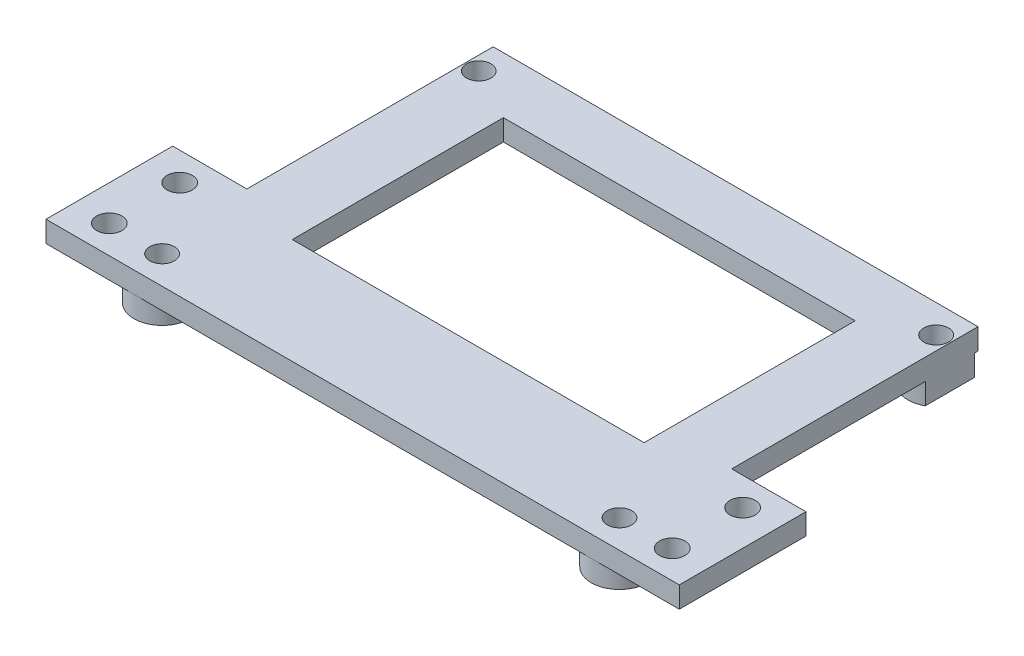
ISO-10303-21;
HEADER;
FILE_DESCRIPTION(('STEP AP214'),'2;1');
FILE_NAME('part.step','',(''),(''),'','','');
FILE_SCHEMA(('AUTOMOTIVE_DESIGN { 1 0 10303 214 1 1 1 1 }'));
ENDSEC;
DATA;
#1=APPLICATION_CONTEXT('core data for automotive mechanical design processes');
#2=APPLICATION_PROTOCOL_DEFINITION('international standard','automotive_design',2000,#1);
#3=PRODUCT_CONTEXT('',#1,'mechanical');
#4=PRODUCT('Part','Part','',(#3));
#5=PRODUCT_RELATED_PRODUCT_CATEGORY('part','',(#4));
#6=PRODUCT_DEFINITION_FORMATION('','',#4);
#7=PRODUCT_DEFINITION_CONTEXT('part definition',#1,'design');
#8=PRODUCT_DEFINITION('design','',#6,#7);
#9=PRODUCT_DEFINITION_SHAPE('','',#8);
#10=(LENGTH_UNIT() NAMED_UNIT(*) SI_UNIT(.MILLI.,.METRE.));
#11=(NAMED_UNIT(*) PLANE_ANGLE_UNIT() SI_UNIT($,.RADIAN.));
#12=(NAMED_UNIT(*) SI_UNIT($,.STERADIAN.) SOLID_ANGLE_UNIT());
#13=UNCERTAINTY_MEASURE_WITH_UNIT(LENGTH_MEASURE(1.E-05),#10,'distance_accuracy_value','');
#14=(GEOMETRIC_REPRESENTATION_CONTEXT(3) GLOBAL_UNCERTAINTY_ASSIGNED_CONTEXT((#13)) GLOBAL_UNIT_ASSIGNED_CONTEXT((#10,
#11,#12)) REPRESENTATION_CONTEXT('',''));
#15=CARTESIAN_POINT('',(0.,0.,0.));
#16=DIRECTION('',(0.,0.,1.));
#17=DIRECTION('',(1.,0.,0.));
#18=AXIS2_PLACEMENT_3D('',#15,#16,#17);
#19=CARTESIAN_POINT('',(0.,0.,-44.));
#20=DIRECTION('',(0.,0.,-1.));
#21=DIRECTION('',(-1.,0.,0.));
#22=AXIS2_PLACEMENT_3D('',#19,#20,#21);
#23=PLANE('',#22);
#24=DIRECTION('',(-1.,0.,0.));
#25=VECTOR('',#24,1.);
#26=CARTESIAN_POINT('',(34.85,0.,-44.));
#27=LINE('',#26,#25);
#28=CARTESIAN_POINT('',(-32.5,0.,-44.));
#29=VERTEX_POINT('',#28);
#30=CARTESIAN_POINT('',(-34.45,0.,-44.));
#31=VERTEX_POINT('',#30);
#32=EDGE_CURVE('E217',#29,#31,#27,.T.);
#33=ORIENTED_EDGE('',*,*,#32,.T.);
#34=DIRECTION('',(0.,1.,0.));
#35=VECTOR('',#34,1.);
#36=CARTESIAN_POINT('',(-34.45,0.,-44.));
#37=LINE('',#36,#35);
#38=CARTESIAN_POINT('',(-34.45,3.,-44.));
#39=VERTEX_POINT('',#38);
#40=EDGE_CURVE('E190',#31,#39,#37,.T.);
#41=ORIENTED_EDGE('',*,*,#40,.T.);
#42=DIRECTION('',(1.,0.,0.));
#43=VECTOR('',#42,1.);
#44=CARTESIAN_POINT('',(-34.85,3.,-44.));
#45=LINE('',#44,#43);
#46=CARTESIAN_POINT('',(34.45,3.,-44.));
#47=VERTEX_POINT('',#46);
#48=EDGE_CURVE('E189',#39,#47,#45,.T.);
#49=ORIENTED_EDGE('',*,*,#48,.T.);
#50=DIRECTION('',(0.,-1.,0.));
#51=VECTOR('',#50,1.);
#52=CARTESIAN_POINT('',(34.45,0.,-44.));
#53=LINE('',#52,#51);
#54=CARTESIAN_POINT('',(34.45,0.,-44.));
#55=VERTEX_POINT('',#54);
#56=EDGE_CURVE('E49',#47,#55,#53,.T.);
#57=ORIENTED_EDGE('',*,*,#56,.T.);
#58=CARTESIAN_POINT('',(32.5,0.,-44.));
#59=VERTEX_POINT('',#58);
#60=EDGE_CURVE('E218',#55,#59,#27,.T.);
#61=ORIENTED_EDGE('',*,*,#60,.T.);
#62=EDGE_CURVE('E222',#59,#29,#27,.T.);
#63=ORIENTED_EDGE('',*,*,#62,.T.);
#64=EDGE_LOOP('',(#33,#41,#49,#57,#61,#63));
#65=FACE_BOUND('',#64,.T.);
#66=ADVANCED_FACE('F41',(#65),#23,.T.);
#67=CARTESIAN_POINT('',(0.,3.,0.));
#68=DIRECTION('',(0.,1.,0.));
#69=DIRECTION('',(0.,0.,1.));
#70=AXIS2_PLACEMENT_3D('',#67,#68,#69);
#71=PLANE('',#70);
#72=CARTESIAN_POINT('',(-40.,3.,-5.));
#73=DIRECTION('',(0.,1.,0.));
#74=DIRECTION('',(0.,0.,1.));
#75=AXIS2_PLACEMENT_3D('',#72,#73,#74);
#76=CIRCLE('',#75,1.8);
#77=CARTESIAN_POINT('',(-40.,3.,-3.20000000000001));
#78=VERTEX_POINT('',#77);
#79=EDGE_CURVE('E294',#78,#78,#76,.T.);
#80=ORIENTED_EDGE('',*,*,#79,.F.);
#81=EDGE_LOOP('',(#80));
#82=FACE_BOUND('',#81,.T.);
#83=CARTESIAN_POINT('',(-40.,3.,5.));
#84=DIRECTION('',(0.,1.,0.));
#85=DIRECTION('',(0.,0.,1.));
#86=AXIS2_PLACEMENT_3D('',#83,#84,#85);
#87=CIRCLE('',#86,1.8);
#88=CARTESIAN_POINT('',(-40.,3.,6.79999999999999));
#89=VERTEX_POINT('',#88);
#90=EDGE_CURVE('E300',#89,#89,#87,.T.);
#91=ORIENTED_EDGE('',*,*,#90,.F.);
#92=EDGE_LOOP('',(#91));
#93=FACE_BOUND('',#92,.T.);
#94=CARTESIAN_POINT('',(40.,3.,5.));
#95=DIRECTION('',(0.,1.,0.));
#96=DIRECTION('',(0.,0.,1.));
#97=AXIS2_PLACEMENT_3D('',#94,#95,#96);
#98=CIRCLE('',#97,1.8);
#99=CARTESIAN_POINT('',(40.,3.,6.79999999999999));
#100=VERTEX_POINT('',#99);
#101=EDGE_CURVE('E304',#100,#100,#98,.T.);
#102=ORIENTED_EDGE('',*,*,#101,.F.);
#103=EDGE_LOOP('',(#102));
#104=FACE_BOUND('',#103,.T.);
#105=CARTESIAN_POINT('',(40.,3.,-5.));
#106=DIRECTION('',(0.,1.,0.));
#107=DIRECTION('',(0.,0.,1.));
#108=AXIS2_PLACEMENT_3D('',#105,#106,#107);
#109=CIRCLE('',#108,1.8);
#110=CARTESIAN_POINT('',(40.,3.,-3.20000000000001));
#111=VERTEX_POINT('',#110);
#112=EDGE_CURVE('E310',#111,#111,#109,.T.);
#113=ORIENTED_EDGE('',*,*,#112,.F.);
#114=EDGE_LOOP('',(#113));
#115=FACE_BOUND('',#114,.T.);
#116=CARTESIAN_POINT('',(32.5,3.,-40.));
#117=DIRECTION('',(0.,1.,0.));
#118=DIRECTION('',(0.,0.,1.));
#119=AXIS2_PLACEMENT_3D('',#116,#117,#118);
#120=CIRCLE('',#119,1.75);
#121=CARTESIAN_POINT('',(32.5,3.,-38.25));
#122=VERTEX_POINT('',#121);
#123=EDGE_CURVE('E237',#122,#122,#120,.F.);
#124=ORIENTED_EDGE('',*,*,#123,.T.);
#125=EDGE_LOOP('',(#124));
#126=FACE_BOUND('',#125,.T.);
#127=CARTESIAN_POINT('',(-32.5,3.,-40.));
#128=DIRECTION('',(0.,1.,0.));
#129=DIRECTION('',(0.,0.,1.));
#130=AXIS2_PLACEMENT_3D('',#127,#128,#129);
#131=CIRCLE('',#130,1.75);
#132=CARTESIAN_POINT('',(-32.5,3.,-38.25));
#133=VERTEX_POINT('',#132);
#134=EDGE_CURVE('E234',#133,#133,#131,.F.);
#135=ORIENTED_EDGE('',*,*,#134,.T.);
#136=EDGE_LOOP('',(#135));
#137=FACE_BOUND('',#136,.T.);
#138=CARTESIAN_POINT('',(-32.5,3.,5.));
#139=DIRECTION('',(0.,1.,0.));
#140=DIRECTION('',(0.,0.,1.));
#141=AXIS2_PLACEMENT_3D('',#138,#139,#140);
#142=CIRCLE('',#141,1.75);
#143=CARTESIAN_POINT('',(-32.5,3.,6.75));
#144=VERTEX_POINT('',#143);
#145=EDGE_CURVE('E231',#144,#144,#142,.F.);
#146=ORIENTED_EDGE('',*,*,#145,.T.);
#147=EDGE_LOOP('',(#146));
#148=FACE_BOUND('',#147,.T.);
#149=CARTESIAN_POINT('',(32.5,3.,5.00000000000001));
#150=DIRECTION('',(0.,1.,0.));
#151=DIRECTION('',(0.,0.,1.));
#152=AXIS2_PLACEMENT_3D('',#149,#150,#151);
#153=CIRCLE('',#152,1.75);
#154=CARTESIAN_POINT('',(32.5,3.,6.75000000000001));
#155=VERTEX_POINT('',#154);
#156=EDGE_CURVE('E228',#155,#155,#153,.F.);
#157=ORIENTED_EDGE('',*,*,#156,.T.);
#158=EDGE_LOOP('',(#157));
#159=FACE_BOUND('',#158,.T.);
#160=DIRECTION('',(0.,0.,1.));
#161=VECTOR('',#160,1.);
#162=CARTESIAN_POINT('',(25.,3.,-6.00000000000001));
#163=LINE('',#162,#161);
#164=CARTESIAN_POINT('',(25.,3.,-36.));
#165=VERTEX_POINT('',#164);
#166=CARTESIAN_POINT('',(25.,3.,-6.00000000000001));
#167=VERTEX_POINT('',#166);
#168=EDGE_CURVE('E226',#165,#167,#163,.T.);
#169=ORIENTED_EDGE('',*,*,#168,.T.);
#170=DIRECTION('',(-1.,0.,0.));
#171=VECTOR('',#170,1.);
#172=CARTESIAN_POINT('',(-25.,3.,-6.));
#173=LINE('',#172,#171);
#174=CARTESIAN_POINT('',(-25.,3.,-6.));
#175=VERTEX_POINT('',#174);
#176=EDGE_CURVE('E342',#167,#175,#173,.T.);
#177=ORIENTED_EDGE('',*,*,#176,.T.);
#178=DIRECTION('',(0.,0.,-1.));
#179=VECTOR('',#178,1.);
#180=CARTESIAN_POINT('',(-25.,3.,-6.));
#181=LINE('',#180,#179);
#182=CARTESIAN_POINT('',(-25.,3.,-36.));
#183=VERTEX_POINT('',#182);
#184=EDGE_CURVE('E221',#175,#183,#181,.T.);
#185=ORIENTED_EDGE('',*,*,#184,.T.);
#186=DIRECTION('',(1.,0.,0.));
#187=VECTOR('',#186,1.);
#188=CARTESIAN_POINT('',(-25.,3.,-36.));
#189=LINE('',#188,#187);
#190=EDGE_CURVE('E224',#183,#165,#189,.T.);
#191=ORIENTED_EDGE('',*,*,#190,.T.);
#192=EDGE_LOOP('',(#169,#177,#185,#191));
#193=FACE_BOUND('',#192,.T.);
#194=DIRECTION('',(0.,0.,1.));
#195=VECTOR('',#194,1.);
#196=CARTESIAN_POINT('',(-34.45,3.,0.));
#197=LINE('',#196,#195);
#198=CARTESIAN_POINT('',(-34.45,3.,-9.));
#199=VERTEX_POINT('',#198);
#200=EDGE_CURVE('E181',#39,#199,#197,.T.);
#201=ORIENTED_EDGE('',*,*,#200,.T.);
#202=DIRECTION('',(-1.,0.,0.));
#203=VECTOR('',#202,1.);
#204=CARTESIAN_POINT('',(0.,3.,-9.));
#205=LINE('',#204,#203);
#206=CARTESIAN_POINT('',(-45.,3.,-9.));
#207=VERTEX_POINT('',#206);
#208=EDGE_CURVE('E166',#199,#207,#205,.T.);
#209=ORIENTED_EDGE('',*,*,#208,.T.);
#210=DIRECTION('',(0.,0.,-1.));
#211=VECTOR('',#210,1.);
#212=CARTESIAN_POINT('',(-45.,3.,0.));
#213=LINE('',#212,#211);
#214=CARTESIAN_POINT('',(-45.,3.,9.));
#215=VERTEX_POINT('',#214);
#216=EDGE_CURVE('E317',#215,#207,#213,.T.);
#217=ORIENTED_EDGE('',*,*,#216,.F.);
#218=DIRECTION('',(-1.,0.,0.));
#219=VECTOR('',#218,1.);
#220=CARTESIAN_POINT('',(0.,3.,9.));
#221=LINE('',#220,#219);
#222=CARTESIAN_POINT('',(45.,3.,9.));
#223=VERTEX_POINT('',#222);
#224=EDGE_CURVE('E319',#223,#215,#221,.T.);
#225=ORIENTED_EDGE('',*,*,#224,.F.);
#226=DIRECTION('',(0.,0.,-1.));
#227=VECTOR('',#226,1.);
#228=CARTESIAN_POINT('',(45.,3.,0.));
#229=LINE('',#228,#227);
#230=CARTESIAN_POINT('',(45.,3.,-9.));
#231=VERTEX_POINT('',#230);
#232=EDGE_CURVE('E177',#223,#231,#229,.T.);
#233=ORIENTED_EDGE('',*,*,#232,.T.);
#234=CARTESIAN_POINT('',(34.45,3.,-9.));
#235=VERTEX_POINT('',#234);
#236=EDGE_CURVE('E176',#231,#235,#205,.T.);
#237=ORIENTED_EDGE('',*,*,#236,.T.);
#238=DIRECTION('',(0.,0.,1.));
#239=VECTOR('',#238,1.);
#240=CARTESIAN_POINT('',(34.45,3.,0.));
#241=LINE('',#240,#239);
#242=EDGE_CURVE('E200',#47,#235,#241,.T.);
#243=ORIENTED_EDGE('',*,*,#242,.F.);
#244=ORIENTED_EDGE('',*,*,#48,.F.);
#245=EDGE_LOOP('',(#201,#209,#217,#225,#233,#237,#243,#244));
#246=FACE_BOUND('',#245,.T.);
#247=ADVANCED_FACE('F187',(#82,#93,#104,#115,#126,#137,#148,#159,#193,#246),#71,.T.);
#248=CARTESIAN_POINT('',(0.,0.,0.));
#249=DIRECTION('',(0.,1.,0.));
#250=DIRECTION('',(0.,0.,1.));
#251=AXIS2_PLACEMENT_3D('',#248,#249,#250);
#252=PLANE('',#251);
#253=DIRECTION('',(-1.,0.,0.));
#254=VECTOR('',#253,1.);
#255=CARTESIAN_POINT('',(-25.,0.,-6.));
#256=LINE('',#255,#254);
#257=CARTESIAN_POINT('',(25.,0.,-6.00000000000001));
#258=VERTEX_POINT('',#257);
#259=CARTESIAN_POINT('',(-25.,0.,-6.));
#260=VERTEX_POINT('',#259);
#261=EDGE_CURVE('E243',#258,#260,#256,.T.);
#262=ORIENTED_EDGE('',*,*,#261,.F.);
#263=DIRECTION('',(0.,0.,1.));
#264=VECTOR('',#263,1.);
#265=CARTESIAN_POINT('',(25.,0.,-6.00000000000001));
#266=LINE('',#265,#264);
#267=CARTESIAN_POINT('',(25.,0.,-36.));
#268=VERTEX_POINT('',#267);
#269=EDGE_CURVE('E240',#268,#258,#266,.T.);
#270=ORIENTED_EDGE('',*,*,#269,.F.);
#271=DIRECTION('',(1.,0.,0.));
#272=VECTOR('',#271,1.);
#273=CARTESIAN_POINT('',(-25.,0.,-36.));
#274=LINE('',#273,#272);
#275=CARTESIAN_POINT('',(-25.,0.,-36.));
#276=VERTEX_POINT('',#275);
#277=EDGE_CURVE('E249',#276,#268,#274,.T.);
#278=ORIENTED_EDGE('',*,*,#277,.F.);
#279=DIRECTION('',(0.,0.,-1.));
#280=VECTOR('',#279,1.);
#281=CARTESIAN_POINT('',(-25.,0.,-6.));
#282=LINE('',#281,#280);
#283=EDGE_CURVE('E246',#260,#276,#282,.T.);
#284=ORIENTED_EDGE('',*,*,#283,.F.);
#285=EDGE_LOOP('',(#262,#270,#278,#284));
#286=FACE_BOUND('',#285,.T.);
#287=CARTESIAN_POINT('',(-40.,0.,-5.));
#288=DIRECTION('',(0.,1.,0.));
#289=DIRECTION('',(0.,0.,1.));
#290=AXIS2_PLACEMENT_3D('',#287,#288,#289);
#291=CIRCLE('',#290,1.8);
#292=CARTESIAN_POINT('',(-40.,0.,-3.20000000000001));
#293=VERTEX_POINT('',#292);
#294=EDGE_CURVE('E299',#293,#293,#291,.T.);
#295=ORIENTED_EDGE('',*,*,#294,.T.);
#296=EDGE_LOOP('',(#295));
#297=FACE_BOUND('',#296,.T.);
#298=CARTESIAN_POINT('',(-40.,0.,5.));
#299=DIRECTION('',(0.,1.,0.));
#300=DIRECTION('',(0.,0.,1.));
#301=AXIS2_PLACEMENT_3D('',#298,#299,#300);
#302=CIRCLE('',#301,1.8);
#303=CARTESIAN_POINT('',(-40.,0.,6.79999999999999));
#304=VERTEX_POINT('',#303);
#305=EDGE_CURVE('E303',#304,#304,#302,.T.);
#306=ORIENTED_EDGE('',*,*,#305,.T.);
#307=EDGE_LOOP('',(#306));
#308=FACE_BOUND('',#307,.T.);
#309=CARTESIAN_POINT('',(40.,0.,5.));
#310=DIRECTION('',(0.,1.,0.));
#311=DIRECTION('',(0.,0.,1.));
#312=AXIS2_PLACEMENT_3D('',#309,#310,#311);
#313=CIRCLE('',#312,1.8);
#314=CARTESIAN_POINT('',(40.,0.,6.79999999999999));
#315=VERTEX_POINT('',#314);
#316=EDGE_CURVE('E307',#315,#315,#313,.T.);
#317=ORIENTED_EDGE('',*,*,#316,.T.);
#318=EDGE_LOOP('',(#317));
#319=FACE_BOUND('',#318,.T.);
#320=CARTESIAN_POINT('',(40.,0.,-5.));
#321=DIRECTION('',(0.,1.,0.));
#322=DIRECTION('',(0.,0.,1.));
#323=AXIS2_PLACEMENT_3D('',#320,#321,#322);
#324=CIRCLE('',#323,1.8);
#325=CARTESIAN_POINT('',(40.,0.,-3.20000000000001));
#326=VERTEX_POINT('',#325);
#327=EDGE_CURVE('E313',#326,#326,#324,.T.);
#328=ORIENTED_EDGE('',*,*,#327,.T.);
#329=EDGE_LOOP('',(#328));
#330=FACE_BOUND('',#329,.T.);
#331=DIRECTION('',(-1.,0.,0.));
#332=VECTOR('',#331,1.);
#333=CARTESIAN_POINT('',(0.,0.,-9.));
#334=LINE('',#333,#332);
#335=CARTESIAN_POINT('',(-34.45,0.,-9.));
#336=VERTEX_POINT('',#335);
#337=CARTESIAN_POINT('',(-45.,0.,-9.));
#338=VERTEX_POINT('',#337);
#339=EDGE_CURVE('E331',#336,#338,#334,.T.);
#340=ORIENTED_EDGE('',*,*,#339,.F.);
#341=DIRECTION('',(0.,0.,1.));
#342=VECTOR('',#341,1.);
#343=CARTESIAN_POINT('',(-34.45,0.,0.));
#344=LINE('',#343,#342);
#345=CARTESIAN_POINT('',(-34.45,0.,-36.50750805298));
#346=VERTEX_POINT('',#345);
#347=EDGE_CURVE('E184',#346,#336,#344,.T.);
#348=ORIENTED_EDGE('',*,*,#347,.F.);
#349=CARTESIAN_POINT('',(-32.5,0.,-40.));
#350=DIRECTION('',(0.,-1.,0.));
#351=DIRECTION('',(0.,0.,-1.));
#352=AXIS2_PLACEMENT_3D('',#349,#350,#351);
#353=CIRCLE('',#352,4.);
#354=EDGE_CURVE('E282',#29,#346,#353,.T.);
#355=ORIENTED_EDGE('',*,*,#354,.F.);
#356=ORIENTED_EDGE('',*,*,#62,.F.);
#357=CARTESIAN_POINT('',(32.5,0.,-40.));
#358=DIRECTION('',(0.,-1.,0.));
#359=DIRECTION('',(0.,0.,-1.));
#360=AXIS2_PLACEMENT_3D('',#357,#358,#359);
#361=CIRCLE('',#360,4.00000000000001);
#362=CARTESIAN_POINT('',(34.45,0.,-36.5075080529799));
#363=VERTEX_POINT('',#362);
#364=EDGE_CURVE('E295',#363,#59,#361,.T.);
#365=ORIENTED_EDGE('',*,*,#364,.F.);
#366=DIRECTION('',(0.,0.,-1.));
#367=VECTOR('',#366,1.);
#368=CARTESIAN_POINT('',(34.45,0.,0.));
#369=LINE('',#368,#367);
#370=CARTESIAN_POINT('',(34.45,0.,-9.));
#371=VERTEX_POINT('',#370);
#372=EDGE_CURVE('E213',#371,#363,#369,.T.);
#373=ORIENTED_EDGE('',*,*,#372,.F.);
#374=CARTESIAN_POINT('',(45.,0.,-9.));
#375=VERTEX_POINT('',#374);
#376=EDGE_CURVE('E320',#375,#371,#334,.T.);
#377=ORIENTED_EDGE('',*,*,#376,.F.);
#378=DIRECTION('',(0.,0.,-1.));
#379=VECTOR('',#378,1.);
#380=CARTESIAN_POINT('',(45.,0.,0.));
#381=LINE('',#380,#379);
#382=CARTESIAN_POINT('',(45.,0.,9.));
#383=VERTEX_POINT('',#382);
#384=EDGE_CURVE('E328',#383,#375,#381,.T.);
#385=ORIENTED_EDGE('',*,*,#384,.F.);
#386=DIRECTION('',(-1.,0.,0.));
#387=VECTOR('',#386,1.);
#388=CARTESIAN_POINT('',(0.,0.,9.));
#389=LINE('',#388,#387);
#390=CARTESIAN_POINT('',(32.5,0.,9.00000000000001));
#391=VERTEX_POINT('',#390);
#392=EDGE_CURVE('E326',#383,#391,#389,.T.);
#393=ORIENTED_EDGE('',*,*,#392,.T.);
#394=CARTESIAN_POINT('',(32.5,0.,5.00000000000001));
#395=DIRECTION('',(0.,-1.,0.));
#396=DIRECTION('',(0.,0.,-1.));
#397=AXIS2_PLACEMENT_3D('',#394,#395,#396);
#398=CIRCLE('',#397,4.00000000000001);
#399=EDGE_CURVE('E272',#391,#391,#398,.T.);
#400=ORIENTED_EDGE('',*,*,#399,.F.);
#401=CARTESIAN_POINT('',(-32.5,0.,9.));
#402=VERTEX_POINT('',#401);
#403=EDGE_CURVE('E329',#391,#402,#389,.T.);
#404=ORIENTED_EDGE('',*,*,#403,.T.);
#405=CARTESIAN_POINT('',(-32.5,0.,5.));
#406=DIRECTION('',(0.,-1.,0.));
#407=DIRECTION('',(0.,0.,-1.));
#408=AXIS2_PLACEMENT_3D('',#405,#406,#407);
#409=CIRCLE('',#408,4.);
#410=EDGE_CURVE('E276',#402,#402,#409,.T.);
#411=ORIENTED_EDGE('',*,*,#410,.F.);
#412=CARTESIAN_POINT('',(-45.,0.,9.));
#413=VERTEX_POINT('',#412);
#414=EDGE_CURVE('E325',#402,#413,#389,.T.);
#415=ORIENTED_EDGE('',*,*,#414,.T.);
#416=DIRECTION('',(0.,0.,-1.));
#417=VECTOR('',#416,1.);
#418=CARTESIAN_POINT('',(-45.,0.,0.));
#419=LINE('',#418,#417);
#420=EDGE_CURVE('E316',#413,#338,#419,.T.);
#421=ORIENTED_EDGE('',*,*,#420,.T.);
#422=EDGE_LOOP('',(#340,#348,#355,#356,#365,#373,#377,#385,#393,#400,#404,#411,#415,#421));
#423=FACE_BOUND('',#422,.T.);
#424=ADVANCED_FACE('F364',(#286,#297,#308,#319,#330,#423),#252,.F.);
#425=DIRECTION('',(0.,0.,1.));
#426=VECTOR('',#425,1.);
#427=CARTESIAN_POINT('',(-34.45,0.,0.));
#428=LINE('',#427,#426);
#429=CARTESIAN_POINT('',(-34.45,0.,-43.4924919470201));
#430=VERTEX_POINT('',#429);
#431=EDGE_CURVE('E197',#31,#430,#428,.T.);
#432=ORIENTED_EDGE('',*,*,#431,.F.);
#433=ORIENTED_EDGE('',*,*,#32,.F.);
#434=EDGE_CURVE('E289',#430,#29,#353,.T.);
#435=ORIENTED_EDGE('',*,*,#434,.F.);
#436=EDGE_LOOP('',(#432,#433,#435));
#437=FACE_BOUND('',#436,.T.);
#438=ADVANCED_FACE('F372',(#437),#252,.F.);
#439=CARTESIAN_POINT('',(-32.5,-3.,-40.));
#440=DIRECTION('',(0.,1.,0.));
#441=DIRECTION('',(0.,0.,1.));
#442=AXIS2_PLACEMENT_3D('',#439,#440,#441);
#443=CYLINDRICAL_SURFACE('',#442,4.);
#444=DIRECTION('',(0.,1.,0.));
#445=VECTOR('',#444,1.);
#446=CARTESIAN_POINT('',(-34.45,-3.,-36.50750805298));
#447=LINE('',#446,#445);
#448=CARTESIAN_POINT('',(-34.45,-3.,-36.50750805298));
#449=VERTEX_POINT('',#448);
#450=EDGE_CURVE('E195',#449,#346,#447,.T.);
#451=ORIENTED_EDGE('',*,*,#450,.F.);
#452=CARTESIAN_POINT('',(-32.5,-3.,-40.));
#453=DIRECTION('',(0.,-1.,0.));
#454=DIRECTION('',(0.,0.,-1.));
#455=AXIS2_PLACEMENT_3D('',#452,#453,#454);
#456=CIRCLE('',#455,4.);
#457=CARTESIAN_POINT('',(-34.45,-3.,-43.4924919470201));
#458=VERTEX_POINT('',#457);
#459=EDGE_CURVE('E285',#458,#449,#456,.T.);
#460=ORIENTED_EDGE('',*,*,#459,.F.);
#461=DIRECTION('',(0.,1.,0.));
#462=VECTOR('',#461,1.);
#463=CARTESIAN_POINT('',(-34.45,-3.,-43.4924919470201));
#464=LINE('',#463,#462);
#465=EDGE_CURVE('E56',#430,#458,#464,.F.);
#466=ORIENTED_EDGE('',*,*,#465,.F.);
#467=ORIENTED_EDGE('',*,*,#434,.T.);
#468=ORIENTED_EDGE('',*,*,#354,.T.);
#469=EDGE_LOOP('',(#451,#460,#466,#467,#468));
#470=FACE_BOUND('',#469,.T.);
#471=ADVANCED_FACE('F376',(#470),#443,.T.);
#472=CARTESIAN_POINT('',(0.,-3.,0.));
#473=DIRECTION('',(0.,-1.,0.));
#474=DIRECTION('',(0.,0.,-1.));
#475=AXIS2_PLACEMENT_3D('',#472,#473,#474);
#476=PLANE('',#475);
#477=CARTESIAN_POINT('',(-32.5,-3.,-40.));
#478=DIRECTION('',(0.,-1.,0.));
#479=DIRECTION('',(0.,0.,-1.));
#480=AXIS2_PLACEMENT_3D('',#477,#478,#479);
#481=CIRCLE('',#480,1.75);
#482=CARTESIAN_POINT('',(-32.5,-3.,-41.75));
#483=VERTEX_POINT('',#482);
#484=EDGE_CURVE('E266',#483,#483,#481,.T.);
#485=ORIENTED_EDGE('',*,*,#484,.F.);
#486=EDGE_LOOP('',(#485));
#487=FACE_BOUND('',#486,.T.);
#488=ORIENTED_EDGE('',*,*,#459,.T.);
#489=DIRECTION('',(0.,0.,-1.));
#490=VECTOR('',#489,1.);
#491=CARTESIAN_POINT('',(-34.45,-3.,0.));
#492=LINE('',#491,#490);
#493=EDGE_CURVE('E11',#449,#458,#492,.T.);
#494=ORIENTED_EDGE('',*,*,#493,.T.);
#495=EDGE_LOOP('',(#488,#494));
#496=FACE_BOUND('',#495,.T.);
#497=ADVANCED_FACE('F378',(#487,#496),#476,.T.);
#498=DIRECTION('',(0.,0.,-1.));
#499=VECTOR('',#498,1.);
#500=CARTESIAN_POINT('',(34.45,0.,0.));
#501=LINE('',#500,#499);
#502=CARTESIAN_POINT('',(34.45,0.,-43.4924919470201));
#503=VERTEX_POINT('',#502);
#504=EDGE_CURVE('E63',#503,#55,#501,.T.);
#505=ORIENTED_EDGE('',*,*,#504,.F.);
#506=EDGE_CURVE('E288',#59,#503,#361,.T.);
#507=ORIENTED_EDGE('',*,*,#506,.F.);
#508=ORIENTED_EDGE('',*,*,#60,.F.);
#509=EDGE_LOOP('',(#505,#507,#508));
#510=FACE_BOUND('',#509,.T.);
#511=ADVANCED_FACE('F354',(#510),#252,.F.);
#512=CARTESIAN_POINT('',(32.5,-3.,-40.));
#513=DIRECTION('',(0.,1.,0.));
#514=DIRECTION('',(0.,0.,1.));
#515=AXIS2_PLACEMENT_3D('',#512,#513,#514);
#516=CYLINDRICAL_SURFACE('',#515,4.00000000000001);
#517=DIRECTION('',(0.,1.,0.));
#518=VECTOR('',#517,1.);
#519=CARTESIAN_POINT('',(34.45,-3.,-43.4924919470201));
#520=LINE('',#519,#518);
#521=CARTESIAN_POINT('',(34.45,-3.,-43.4924919470201));
#522=VERTEX_POINT('',#521);
#523=EDGE_CURVE('E211',#522,#503,#520,.T.);
#524=ORIENTED_EDGE('',*,*,#523,.F.);
#525=CARTESIAN_POINT('',(32.5,-3.,-40.));
#526=DIRECTION('',(0.,-1.,0.));
#527=DIRECTION('',(0.,0.,-1.));
#528=AXIS2_PLACEMENT_3D('',#525,#526,#527);
#529=CIRCLE('',#528,4.00000000000001);
#530=CARTESIAN_POINT('',(34.45,-3.,-36.5075080529799));
#531=VERTEX_POINT('',#530);
#532=EDGE_CURVE('E291',#531,#522,#529,.T.);
#533=ORIENTED_EDGE('',*,*,#532,.F.);
#534=DIRECTION('',(0.,1.,0.));
#535=VECTOR('',#534,1.);
#536=CARTESIAN_POINT('',(34.45,-3.,-36.5075080529799));
#537=LINE('',#536,#535);
#538=EDGE_CURVE('E209',#363,#531,#537,.F.);
#539=ORIENTED_EDGE('',*,*,#538,.F.);
#540=ORIENTED_EDGE('',*,*,#364,.T.);
#541=ORIENTED_EDGE('',*,*,#506,.T.);
#542=EDGE_LOOP('',(#524,#533,#539,#540,#541));
#543=FACE_BOUND('',#542,.T.);
#544=ADVANCED_FACE('F358',(#543),#516,.T.);
#545=CARTESIAN_POINT('',(0.,-3.,0.));
#546=DIRECTION('',(0.,-1.,0.));
#547=DIRECTION('',(0.,0.,-1.));
#548=AXIS2_PLACEMENT_3D('',#545,#546,#547);
#549=PLANE('',#548);
#550=CARTESIAN_POINT('',(32.5,-3.,-40.));
#551=DIRECTION('',(0.,-1.,0.));
#552=DIRECTION('',(0.,0.,-1.));
#553=AXIS2_PLACEMENT_3D('',#550,#551,#552);
#554=CIRCLE('',#553,1.75);
#555=CARTESIAN_POINT('',(32.5,-3.,-41.75));
#556=VERTEX_POINT('',#555);
#557=EDGE_CURVE('E269',#556,#556,#554,.T.);
#558=ORIENTED_EDGE('',*,*,#557,.F.);
#559=EDGE_LOOP('',(#558));
#560=FACE_BOUND('',#559,.T.);
#561=ORIENTED_EDGE('',*,*,#532,.T.);
#562=DIRECTION('',(0.,0.,1.));
#563=VECTOR('',#562,1.);
#564=CARTESIAN_POINT('',(34.45,-3.,0.));
#565=LINE('',#564,#563);
#566=EDGE_CURVE('E206',#522,#531,#565,.T.);
#567=ORIENTED_EDGE('',*,*,#566,.T.);
#568=EDGE_LOOP('',(#561,#567));
#569=FACE_BOUND('',#568,.T.);
#570=ADVANCED_FACE('F399',(#560,#569),#549,.T.);
#571=CARTESIAN_POINT('',(0.,3.,9.));
#572=DIRECTION('',(0.,0.,1.));
#573=DIRECTION('',(1.,0.,0.));
#574=AXIS2_PLACEMENT_3D('',#571,#572,#573);
#575=PLANE('',#574);
#576=ORIENTED_EDGE('',*,*,#224,.T.);
#577=DIRECTION('',(0.,-1.,0.));
#578=VECTOR('',#577,1.);
#579=CARTESIAN_POINT('',(-45.,3.,9.));
#580=LINE('',#579,#578);
#581=EDGE_CURVE('E339',#215,#413,#580,.T.);
#582=ORIENTED_EDGE('',*,*,#581,.T.);
#583=ORIENTED_EDGE('',*,*,#414,.F.);
#584=ORIENTED_EDGE('',*,*,#403,.F.);
#585=ORIENTED_EDGE('',*,*,#392,.F.);
#586=DIRECTION('',(0.,-1.,0.));
#587=VECTOR('',#586,1.);
#588=CARTESIAN_POINT('',(45.,3.,9.));
#589=LINE('',#588,#587);
#590=EDGE_CURVE('E337',#223,#383,#589,.T.);
#591=ORIENTED_EDGE('',*,*,#590,.F.);
#592=EDGE_LOOP('',(#576,#582,#583,#584,#585,#591));
#593=FACE_BOUND('',#592,.T.);
#594=ADVANCED_FACE('F386',(#593),#575,.T.);
#595=CARTESIAN_POINT('',(25.,8.,-6.00000000000001));
#596=DIRECTION('',(1.,0.,0.));
#597=DIRECTION('',(0.,0.,-1.));
#598=AXIS2_PLACEMENT_3D('',#595,#596,#597);
#599=PLANE('',#598);
#600=ORIENTED_EDGE('',*,*,#168,.F.);
#601=DIRECTION('',(0.,-1.,0.));
#602=VECTOR('',#601,1.);
#603=CARTESIAN_POINT('',(25.,8.,-36.));
#604=LINE('',#603,#602);
#605=EDGE_CURVE('E253',#165,#268,#604,.T.);
#606=ORIENTED_EDGE('',*,*,#605,.T.);
#607=ORIENTED_EDGE('',*,*,#269,.T.);
#608=DIRECTION('',(0.,-1.,0.));
#609=VECTOR('',#608,1.);
#610=CARTESIAN_POINT('',(25.,8.,-6.00000000000001));
#611=LINE('',#610,#609);
#612=EDGE_CURVE('E252',#167,#258,#611,.T.);
#613=ORIENTED_EDGE('',*,*,#612,.F.);
#614=EDGE_LOOP('',(#600,#606,#607,#613));
#615=FACE_BOUND('',#614,.T.);
#616=ADVANCED_FACE('F408',(#615),#599,.F.);
#617=CARTESIAN_POINT('',(-25.,8.,-36.));
#618=DIRECTION('',(0.,0.,-1.));
#619=DIRECTION('',(-1.,0.,0.));
#620=AXIS2_PLACEMENT_3D('',#617,#618,#619);
#621=PLANE('',#620);
#622=ORIENTED_EDGE('',*,*,#190,.F.);
#623=DIRECTION('',(0.,-1.,0.));
#624=VECTOR('',#623,1.);
#625=CARTESIAN_POINT('',(-25.,8.,-36.));
#626=LINE('',#625,#624);
#627=EDGE_CURVE('E256',#183,#276,#626,.T.);
#628=ORIENTED_EDGE('',*,*,#627,.T.);
#629=ORIENTED_EDGE('',*,*,#277,.T.);
#630=ORIENTED_EDGE('',*,*,#605,.F.);
#631=EDGE_LOOP('',(#622,#628,#629,#630));
#632=FACE_BOUND('',#631,.T.);
#633=ADVANCED_FACE('F424',(#632),#621,.F.);
#634=CARTESIAN_POINT('',(-25.,8.,-6.));
#635=DIRECTION('',(-1.,0.,0.));
#636=DIRECTION('',(0.,0.,1.));
#637=AXIS2_PLACEMENT_3D('',#634,#635,#636);
#638=PLANE('',#637);
#639=ORIENTED_EDGE('',*,*,#184,.F.);
#640=DIRECTION('',(0.,-1.,0.));
#641=VECTOR('',#640,1.);
#642=CARTESIAN_POINT('',(-25.,8.,-6.));
#643=LINE('',#642,#641);
#644=EDGE_CURVE('E258',#175,#260,#643,.T.);
#645=ORIENTED_EDGE('',*,*,#644,.T.);
#646=ORIENTED_EDGE('',*,*,#283,.T.);
#647=ORIENTED_EDGE('',*,*,#627,.F.);
#648=EDGE_LOOP('',(#639,#645,#646,#647));
#649=FACE_BOUND('',#648,.T.);
#650=ADVANCED_FACE('F427',(#649),#638,.F.);
#651=CARTESIAN_POINT('',(-25.,8.,-6.));
#652=DIRECTION('',(0.,0.,1.));
#653=DIRECTION('',(1.,0.,0.));
#654=AXIS2_PLACEMENT_3D('',#651,#652,#653);
#655=PLANE('',#654);
#656=ORIENTED_EDGE('',*,*,#176,.F.);
#657=ORIENTED_EDGE('',*,*,#612,.T.);
#658=ORIENTED_EDGE('',*,*,#261,.T.);
#659=ORIENTED_EDGE('',*,*,#644,.F.);
#660=EDGE_LOOP('',(#656,#657,#658,#659));
#661=FACE_BOUND('',#660,.T.);
#662=ADVANCED_FACE('F431',(#661),#655,.F.);
#663=CARTESIAN_POINT('',(0.,3.,-9.));
#664=DIRECTION('',(0.,0.,1.));
#665=DIRECTION('',(1.,0.,0.));
#666=AXIS2_PLACEMENT_3D('',#663,#664,#665);
#667=PLANE('',#666);
#668=ORIENTED_EDGE('',*,*,#376,.T.);
#669=DIRECTION('',(0.,-1.,0.));
#670=VECTOR('',#669,1.);
#671=CARTESIAN_POINT('',(34.45,0.,-9.));
#672=LINE('',#671,#670);
#673=EDGE_CURVE('E203',#235,#371,#672,.T.);
#674=ORIENTED_EDGE('',*,*,#673,.F.);
#675=ORIENTED_EDGE('',*,*,#236,.F.);
#676=DIRECTION('',(0.,-1.,0.));
#677=VECTOR('',#676,1.);
#678=CARTESIAN_POINT('',(45.,3.,-9.));
#679=LINE('',#678,#677);
#680=EDGE_CURVE('E334',#231,#375,#679,.T.);
#681=ORIENTED_EDGE('',*,*,#680,.T.);
#682=EDGE_LOOP('',(#668,#674,#675,#681));
#683=FACE_BOUND('',#682,.T.);
#684=ADVANCED_FACE('F396',(#683),#667,.F.);
#685=CARTESIAN_POINT('',(-45.,3.,0.));
#686=DIRECTION('',(-1.,0.,0.));
#687=DIRECTION('',(0.,0.,1.));
#688=AXIS2_PLACEMENT_3D('',#685,#686,#687);
#689=PLANE('',#688);
#690=ORIENTED_EDGE('',*,*,#420,.F.);
#691=ORIENTED_EDGE('',*,*,#581,.F.);
#692=ORIENTED_EDGE('',*,*,#216,.T.);
#693=DIRECTION('',(0.,-1.,0.));
#694=VECTOR('',#693,1.);
#695=CARTESIAN_POINT('',(-45.,3.,-9.));
#696=LINE('',#695,#694);
#697=EDGE_CURVE('E171',#207,#338,#696,.T.);
#698=ORIENTED_EDGE('',*,*,#697,.T.);
#699=EDGE_LOOP('',(#690,#691,#692,#698));
#700=FACE_BOUND('',#699,.T.);
#701=ADVANCED_FACE('F43',(#700),#689,.T.);
#702=CARTESIAN_POINT('',(45.,3.,0.));
#703=DIRECTION('',(-1.,0.,0.));
#704=DIRECTION('',(0.,0.,1.));
#705=AXIS2_PLACEMENT_3D('',#702,#703,#704);
#706=PLANE('',#705);
#707=ORIENTED_EDGE('',*,*,#384,.T.);
#708=ORIENTED_EDGE('',*,*,#680,.F.);
#709=ORIENTED_EDGE('',*,*,#232,.F.);
#710=ORIENTED_EDGE('',*,*,#590,.T.);
#711=EDGE_LOOP('',(#707,#708,#709,#710));
#712=FACE_BOUND('',#711,.T.);
#713=ADVANCED_FACE('F392',(#712),#706,.F.);
#714=ORIENTED_EDGE('',*,*,#208,.F.);
#715=DIRECTION('',(0.,-1.,0.));
#716=VECTOR('',#715,1.);
#717=CARTESIAN_POINT('',(-34.45,0.,-9.));
#718=LINE('',#717,#716);
#719=EDGE_CURVE('E169',#199,#336,#718,.T.);
#720=ORIENTED_EDGE('',*,*,#719,.T.);
#721=ORIENTED_EDGE('',*,*,#339,.T.);
#722=ORIENTED_EDGE('',*,*,#697,.F.);
#723=EDGE_LOOP('',(#714,#720,#721,#722));
#724=FACE_BOUND('',#723,.T.);
#725=ADVANCED_FACE('F168',(#724),#667,.F.);
#726=CARTESIAN_POINT('',(40.,3.,-5.));
#727=DIRECTION('',(0.,1.,0.));
#728=DIRECTION('',(0.,0.,1.));
#729=AXIS2_PLACEMENT_3D('',#726,#727,#728);
#730=CYLINDRICAL_SURFACE('',#729,1.8);
#731=ORIENTED_EDGE('',*,*,#112,.T.);
#732=EDGE_LOOP('',(#731));
#733=FACE_BOUND('',#732,.T.);
#734=ORIENTED_EDGE('',*,*,#327,.F.);
#735=EDGE_LOOP('',(#734));
#736=FACE_BOUND('',#735,.T.);
#737=ADVANCED_FACE('F580',(#733,#736),#730,.F.);
#738=CARTESIAN_POINT('',(40.,3.,5.));
#739=DIRECTION('',(0.,1.,0.));
#740=DIRECTION('',(0.,0.,1.));
#741=AXIS2_PLACEMENT_3D('',#738,#739,#740);
#742=CYLINDRICAL_SURFACE('',#741,1.8);
#743=ORIENTED_EDGE('',*,*,#101,.T.);
#744=EDGE_LOOP('',(#743));
#745=FACE_BOUND('',#744,.T.);
#746=ORIENTED_EDGE('',*,*,#316,.F.);
#747=EDGE_LOOP('',(#746));
#748=FACE_BOUND('',#747,.T.);
#749=ADVANCED_FACE('F572',(#745,#748),#742,.F.);
#750=CARTESIAN_POINT('',(-40.,3.,5.));
#751=DIRECTION('',(0.,1.,0.));
#752=DIRECTION('',(0.,0.,1.));
#753=AXIS2_PLACEMENT_3D('',#750,#751,#752);
#754=CYLINDRICAL_SURFACE('',#753,1.8);
#755=ORIENTED_EDGE('',*,*,#90,.T.);
#756=EDGE_LOOP('',(#755));
#757=FACE_BOUND('',#756,.T.);
#758=ORIENTED_EDGE('',*,*,#305,.F.);
#759=EDGE_LOOP('',(#758));
#760=FACE_BOUND('',#759,.T.);
#761=ADVANCED_FACE('F564',(#757,#760),#754,.F.);
#762=CARTESIAN_POINT('',(-40.,3.,-5.));
#763=DIRECTION('',(0.,1.,0.));
#764=DIRECTION('',(0.,0.,1.));
#765=AXIS2_PLACEMENT_3D('',#762,#763,#764);
#766=CYLINDRICAL_SURFACE('',#765,1.8);
#767=ORIENTED_EDGE('',*,*,#79,.T.);
#768=EDGE_LOOP('',(#767));
#769=FACE_BOUND('',#768,.T.);
#770=ORIENTED_EDGE('',*,*,#294,.F.);
#771=EDGE_LOOP('',(#770));
#772=FACE_BOUND('',#771,.T.);
#773=ADVANCED_FACE('F470',(#769,#772),#766,.F.);
#774=CARTESIAN_POINT('',(-32.5,-3.,5.));
#775=DIRECTION('',(0.,1.,0.));
#776=DIRECTION('',(0.,0.,1.));
#777=AXIS2_PLACEMENT_3D('',#774,#775,#776);
#778=CYLINDRICAL_SURFACE('',#777,4.);
#779=CARTESIAN_POINT('',(-32.5,-3.,5.));
#780=DIRECTION('',(0.,-1.,0.));
#781=DIRECTION('',(0.,0.,-1.));
#782=AXIS2_PLACEMENT_3D('',#779,#780,#781);
#783=CIRCLE('',#782,4.);
#784=CARTESIAN_POINT('',(-32.5,-3.,1.));
#785=VERTEX_POINT('',#784);
#786=EDGE_CURVE('E279',#785,#785,#783,.T.);
#787=ORIENTED_EDGE('',*,*,#786,.F.);
#788=EDGE_LOOP('',(#787));
#789=FACE_BOUND('',#788,.T.);
#790=ORIENTED_EDGE('',*,*,#410,.T.);
#791=EDGE_LOOP('',(#790));
#792=FACE_BOUND('',#791,.T.);
#793=ADVANCED_FACE('F466',(#789,#792),#778,.T.);
#794=CARTESIAN_POINT('',(0.,-3.,0.));
#795=DIRECTION('',(0.,-1.,0.));
#796=DIRECTION('',(0.,0.,-1.));
#797=AXIS2_PLACEMENT_3D('',#794,#795,#796);
#798=PLANE('',#797);
#799=CARTESIAN_POINT('',(-32.5,-3.,5.));
#800=DIRECTION('',(0.,-1.,0.));
#801=DIRECTION('',(0.,0.,-1.));
#802=AXIS2_PLACEMENT_3D('',#799,#800,#801);
#803=CIRCLE('',#802,1.75);
#804=CARTESIAN_POINT('',(-32.5,-3.,3.25));
#805=VERTEX_POINT('',#804);
#806=EDGE_CURVE('E263',#805,#805,#803,.T.);
#807=ORIENTED_EDGE('',*,*,#806,.F.);
#808=EDGE_LOOP('',(#807));
#809=FACE_BOUND('',#808,.T.);
#810=ORIENTED_EDGE('',*,*,#786,.T.);
#811=EDGE_LOOP('',(#810));
#812=FACE_BOUND('',#811,.T.);
#813=ADVANCED_FACE('F462',(#809,#812),#798,.T.);
#814=CARTESIAN_POINT('',(32.5,-3.,5.00000000000001));
#815=DIRECTION('',(0.,1.,0.));
#816=DIRECTION('',(0.,0.,1.));
#817=AXIS2_PLACEMENT_3D('',#814,#815,#816);
#818=CYLINDRICAL_SURFACE('',#817,4.00000000000001);
#819=CARTESIAN_POINT('',(32.5,-3.,5.00000000000001));
#820=DIRECTION('',(0.,-1.,0.));
#821=DIRECTION('',(0.,0.,-1.));
#822=AXIS2_PLACEMENT_3D('',#819,#820,#821);
#823=CIRCLE('',#822,4.00000000000001);
#824=CARTESIAN_POINT('',(32.5,-3.,1.));
#825=VERTEX_POINT('',#824);
#826=EDGE_CURVE('E273',#825,#825,#823,.T.);
#827=ORIENTED_EDGE('',*,*,#826,.F.);
#828=EDGE_LOOP('',(#827));
#829=FACE_BOUND('',#828,.T.);
#830=ORIENTED_EDGE('',*,*,#399,.T.);
#831=EDGE_LOOP('',(#830));
#832=FACE_BOUND('',#831,.T.);
#833=ADVANCED_FACE('F458',(#829,#832),#818,.T.);
#834=CARTESIAN_POINT('',(0.,-3.,0.));
#835=DIRECTION('',(0.,-1.,0.));
#836=DIRECTION('',(0.,0.,-1.));
#837=AXIS2_PLACEMENT_3D('',#834,#835,#836);
#838=PLANE('',#837);
#839=CARTESIAN_POINT('',(32.5,-3.,5.00000000000001));
#840=DIRECTION('',(0.,-1.,0.));
#841=DIRECTION('',(0.,0.,-1.));
#842=AXIS2_PLACEMENT_3D('',#839,#840,#841);
#843=CIRCLE('',#842,1.75);
#844=CARTESIAN_POINT('',(32.5,-3.,3.25000000000001));
#845=VERTEX_POINT('',#844);
#846=EDGE_CURVE('E255',#845,#845,#843,.T.);
#847=ORIENTED_EDGE('',*,*,#846,.F.);
#848=EDGE_LOOP('',(#847));
#849=FACE_BOUND('',#848,.T.);
#850=ORIENTED_EDGE('',*,*,#826,.T.);
#851=EDGE_LOOP('',(#850));
#852=FACE_BOUND('',#851,.T.);
#853=ADVANCED_FACE('F454',(#849,#852),#838,.T.);
#854=CARTESIAN_POINT('',(32.5,-3.,-40.));
#855=DIRECTION('',(0.,-1.,0.));
#856=DIRECTION('',(0.,0.,-1.));
#857=AXIS2_PLACEMENT_3D('',#854,#855,#856);
#858=CYLINDRICAL_SURFACE('',#857,1.75);
#859=ORIENTED_EDGE('',*,*,#123,.F.);
#860=EDGE_LOOP('',(#859));
#861=FACE_BOUND('',#860,.T.);
#862=ORIENTED_EDGE('',*,*,#557,.T.);
#863=EDGE_LOOP('',(#862));
#864=FACE_BOUND('',#863,.T.);
#865=ADVANCED_FACE('F450',(#861,#864),#858,.F.);
#866=CARTESIAN_POINT('',(-32.5,-3.,-40.));
#867=DIRECTION('',(0.,-1.,0.));
#868=DIRECTION('',(0.,0.,-1.));
#869=AXIS2_PLACEMENT_3D('',#866,#867,#868);
#870=CYLINDRICAL_SURFACE('',#869,1.75);
#871=ORIENTED_EDGE('',*,*,#134,.F.);
#872=EDGE_LOOP('',(#871));
#873=FACE_BOUND('',#872,.T.);
#874=ORIENTED_EDGE('',*,*,#484,.T.);
#875=EDGE_LOOP('',(#874));
#876=FACE_BOUND('',#875,.T.);
#877=ADVANCED_FACE('F446',(#873,#876),#870,.F.);
#878=CARTESIAN_POINT('',(-32.5,-3.,5.));
#879=DIRECTION('',(0.,-1.,0.));
#880=DIRECTION('',(0.,0.,-1.));
#881=AXIS2_PLACEMENT_3D('',#878,#879,#880);
#882=CYLINDRICAL_SURFACE('',#881,1.75);
#883=ORIENTED_EDGE('',*,*,#145,.F.);
#884=EDGE_LOOP('',(#883));
#885=FACE_BOUND('',#884,.T.);
#886=ORIENTED_EDGE('',*,*,#806,.T.);
#887=EDGE_LOOP('',(#886));
#888=FACE_BOUND('',#887,.T.);
#889=ADVANCED_FACE('F442',(#885,#888),#882,.F.);
#890=CARTESIAN_POINT('',(32.5,-3.,5.00000000000001));
#891=DIRECTION('',(0.,-1.,0.));
#892=DIRECTION('',(0.,0.,-1.));
#893=AXIS2_PLACEMENT_3D('',#890,#891,#892);
#894=CYLINDRICAL_SURFACE('',#893,1.75);
#895=ORIENTED_EDGE('',*,*,#156,.F.);
#896=EDGE_LOOP('',(#895));
#897=FACE_BOUND('',#896,.T.);
#898=ORIENTED_EDGE('',*,*,#846,.T.);
#899=EDGE_LOOP('',(#898));
#900=FACE_BOUND('',#899,.T.);
#901=ADVANCED_FACE('F439',(#897,#900),#894,.F.);
#902=CARTESIAN_POINT('',(34.45,0.,0.));
#903=DIRECTION('',(1.,0.,0.));
#904=DIRECTION('',(0.,0.,-1.));
#905=AXIS2_PLACEMENT_3D('',#902,#903,#904);
#906=PLANE('',#905);
#907=ORIENTED_EDGE('',*,*,#504,.T.);
#908=ORIENTED_EDGE('',*,*,#56,.F.);
#909=ORIENTED_EDGE('',*,*,#242,.T.);
#910=ORIENTED_EDGE('',*,*,#673,.T.);
#911=ORIENTED_EDGE('',*,*,#372,.T.);
#912=ORIENTED_EDGE('',*,*,#538,.T.);
#913=ORIENTED_EDGE('',*,*,#566,.F.);
#914=ORIENTED_EDGE('',*,*,#523,.T.);
#915=EDGE_LOOP('',(#907,#908,#909,#910,#911,#912,#913,#914));
#916=FACE_BOUND('',#915,.T.);
#917=ADVANCED_FACE('F397',(#916),#906,.T.);
#918=CARTESIAN_POINT('',(-34.45,0.,0.));
#919=DIRECTION('',(-1.,0.,0.));
#920=DIRECTION('',(0.,0.,-1.));
#921=AXIS2_PLACEMENT_3D('',#918,#919,#920);
#922=PLANE('',#921);
#923=ORIENTED_EDGE('',*,*,#347,.T.);
#924=ORIENTED_EDGE('',*,*,#719,.F.);
#925=ORIENTED_EDGE('',*,*,#200,.F.);
#926=ORIENTED_EDGE('',*,*,#40,.F.);
#927=ORIENTED_EDGE('',*,*,#431,.T.);
#928=ORIENTED_EDGE('',*,*,#465,.T.);
#929=ORIENTED_EDGE('',*,*,#493,.F.);
#930=ORIENTED_EDGE('',*,*,#450,.T.);
#931=EDGE_LOOP('',(#923,#924,#925,#926,#927,#928,#929,#930));
#932=FACE_BOUND('',#931,.T.);
#933=ADVANCED_FACE('F180',(#932),#922,.T.);
#934=CLOSED_SHELL('',(#66,#247,#424,#438,#471,#497,#511,#544,#570,#594,#616,#633,#650,#662,#684,
#701,#713,#725,#737,#749,#761,#773,#793,#813,#833,#853,#865,#877,#889,#901,#917,#933));
#935=MANIFOLD_SOLID_BREP('B2',#934);
#936=ADVANCED_BREP_SHAPE_REPRESENTATION('',(#18,#935),#14);
#937=SHAPE_DEFINITION_REPRESENTATION(#9,#936);
ENDSEC;
END-ISO-10303-21;
